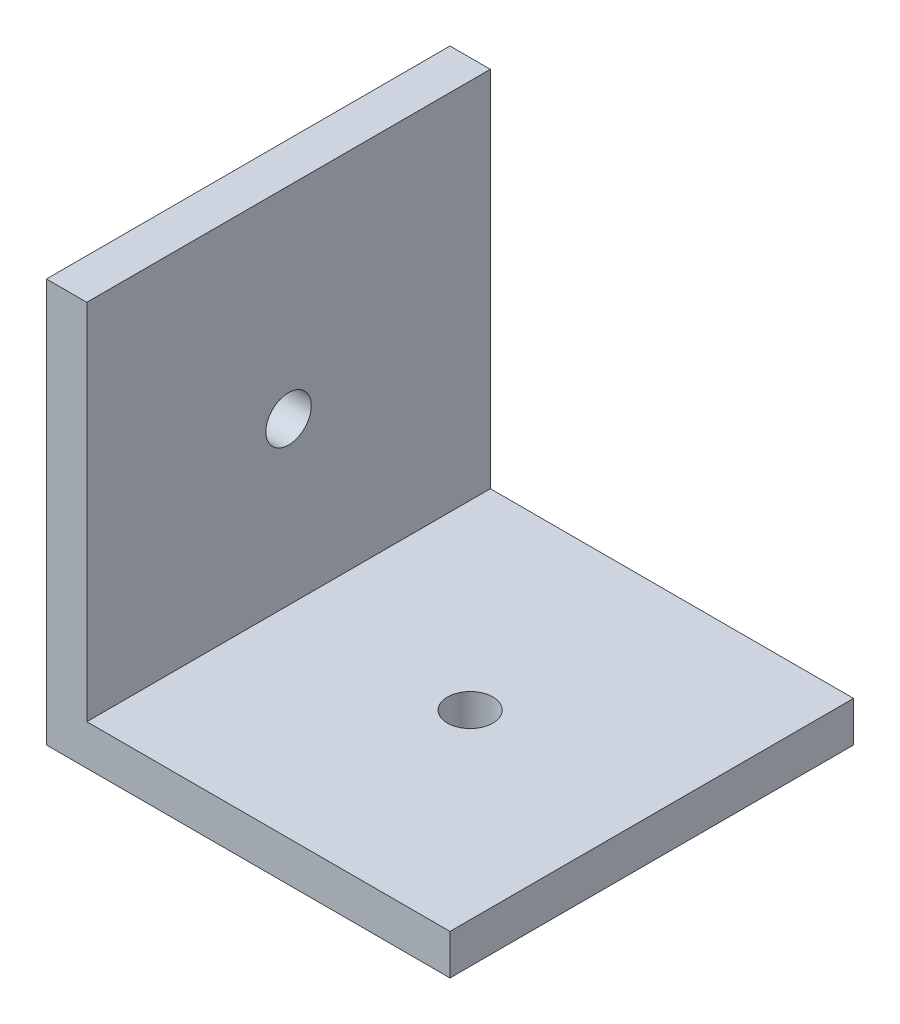
ISO-10303-21;
HEADER;
FILE_DESCRIPTION(('STEP AP214'),'2;1');
FILE_NAME('part.step','',(''),(''),'','','');
FILE_SCHEMA(('AUTOMOTIVE_DESIGN { 1 0 10303 214 1 1 1 1 }'));
ENDSEC;
DATA;
#1=APPLICATION_CONTEXT('core data for automotive mechanical design processes');
#2=APPLICATION_PROTOCOL_DEFINITION('international standard','automotive_design',2000,#1);
#3=PRODUCT_CONTEXT('',#1,'mechanical');
#4=PRODUCT('Part','Part','',(#3));
#5=PRODUCT_RELATED_PRODUCT_CATEGORY('part','',(#4));
#6=PRODUCT_DEFINITION_FORMATION('','',#4);
#7=PRODUCT_DEFINITION_CONTEXT('part definition',#1,'design');
#8=PRODUCT_DEFINITION('design','',#6,#7);
#9=PRODUCT_DEFINITION_SHAPE('','',#8);
#10=(LENGTH_UNIT() NAMED_UNIT(*) SI_UNIT(.MILLI.,.METRE.));
#11=(NAMED_UNIT(*) PLANE_ANGLE_UNIT() SI_UNIT($,.RADIAN.));
#12=(NAMED_UNIT(*) SI_UNIT($,.STERADIAN.) SOLID_ANGLE_UNIT());
#13=UNCERTAINTY_MEASURE_WITH_UNIT(LENGTH_MEASURE(1.E-05),#10,'distance_accuracy_value','');
#14=(GEOMETRIC_REPRESENTATION_CONTEXT(3) GLOBAL_UNCERTAINTY_ASSIGNED_CONTEXT((#13)) GLOBAL_UNIT_ASSIGNED_CONTEXT((#10,
#11,#12)) REPRESENTATION_CONTEXT('',''));
#15=CARTESIAN_POINT('',(0.,0.,0.));
#16=DIRECTION('',(0.,0.,1.));
#17=DIRECTION('',(1.,0.,0.));
#18=AXIS2_PLACEMENT_3D('',#15,#16,#17);
#19=CARTESIAN_POINT('',(-4.,36.,40.));
#20=DIRECTION('',(0.,-1.,0.));
#21=DIRECTION('',(0.,0.,-1.));
#22=AXIS2_PLACEMENT_3D('',#19,#20,#21);
#23=PLANE('',#22);
#24=DIRECTION('',(-1.,0.,0.));
#25=VECTOR('',#24,1.);
#26=CARTESIAN_POINT('',(-4.,36.,0.));
#27=LINE('',#26,#25);
#28=CARTESIAN_POINT('',(0.,36.,0.));
#29=VERTEX_POINT('',#28);
#30=CARTESIAN_POINT('',(-4.,36.,0.));
#31=VERTEX_POINT('',#30);
#32=EDGE_CURVE('E118',#29,#31,#27,.T.);
#33=ORIENTED_EDGE('',*,*,#32,.T.);
#34=DIRECTION('',(0.,0.,-1.));
#35=VECTOR('',#34,1.);
#36=CARTESIAN_POINT('',(-4.,36.,40.));
#37=LINE('',#36,#35);
#38=CARTESIAN_POINT('',(-4.,36.,40.));
#39=VERTEX_POINT('',#38);
#40=EDGE_CURVE('E11',#39,#31,#37,.T.);
#41=ORIENTED_EDGE('',*,*,#40,.F.);
#42=DIRECTION('',(-1.,0.,0.));
#43=VECTOR('',#42,1.);
#44=CARTESIAN_POINT('',(-4.,36.,40.));
#45=LINE('',#44,#43);
#46=CARTESIAN_POINT('',(0.,36.,40.));
#47=VERTEX_POINT('',#46);
#48=EDGE_CURVE('E129',#47,#39,#45,.T.);
#49=ORIENTED_EDGE('',*,*,#48,.F.);
#50=DIRECTION('',(0.,0.,-1.));
#51=VECTOR('',#50,1.);
#52=CARTESIAN_POINT('',(0.,36.,40.));
#53=LINE('',#52,#51);
#54=EDGE_CURVE('E114',#47,#29,#53,.T.);
#55=ORIENTED_EDGE('',*,*,#54,.T.);
#56=EDGE_LOOP('',(#33,#41,#49,#55));
#57=FACE_BOUND('',#56,.T.);
#58=ADVANCED_FACE('F34',(#57),#23,.F.);
#59=CARTESIAN_POINT('',(-4.,-4.00000000000001,40.));
#60=DIRECTION('',(1.,0.,0.));
#61=DIRECTION('',(0.,1.,0.));
#62=AXIS2_PLACEMENT_3D('',#59,#60,#61);
#63=PLANE('',#62);
#64=CARTESIAN_POINT('',(-4.00000000000001,16.,20.));
#65=DIRECTION('',(1.,0.,0.));
#66=DIRECTION('',(0.,0.,-1.));
#67=AXIS2_PLACEMENT_3D('',#64,#65,#66);
#68=CIRCLE('',#67,2.25);
#69=CARTESIAN_POINT('',(-4.00000000000001,16.,17.75));
#70=VERTEX_POINT('',#69);
#71=EDGE_CURVE('E227',#70,#70,#68,.T.);
#72=ORIENTED_EDGE('',*,*,#71,.T.);
#73=EDGE_LOOP('',(#72));
#74=FACE_BOUND('',#73,.T.);
#75=DIRECTION('',(0.,-1.,0.));
#76=VECTOR('',#75,1.);
#77=CARTESIAN_POINT('',(-4.,-4.00000000000001,0.));
#78=LINE('',#77,#76);
#79=CARTESIAN_POINT('',(-4.,-4.00000000000001,0.));
#80=VERTEX_POINT('',#79);
#81=EDGE_CURVE('E121',#31,#80,#78,.T.);
#82=ORIENTED_EDGE('',*,*,#81,.T.);
#83=DIRECTION('',(0.,0.,-1.));
#84=VECTOR('',#83,1.);
#85=CARTESIAN_POINT('',(-4.,-4.00000000000001,40.));
#86=LINE('',#85,#84);
#87=CARTESIAN_POINT('',(-4.,-4.00000000000001,40.));
#88=VERTEX_POINT('',#87);
#89=EDGE_CURVE('E42',#88,#80,#86,.T.);
#90=ORIENTED_EDGE('',*,*,#89,.F.);
#91=DIRECTION('',(0.,-1.,0.));
#92=VECTOR('',#91,1.);
#93=CARTESIAN_POINT('',(-4.,-4.00000000000001,40.));
#94=LINE('',#93,#92);
#95=EDGE_CURVE('E87',#39,#88,#94,.T.);
#96=ORIENTED_EDGE('',*,*,#95,.F.);
#97=ORIENTED_EDGE('',*,*,#40,.T.);
#98=EDGE_LOOP('',(#82,#90,#96,#97));
#99=FACE_BOUND('',#98,.T.);
#100=ADVANCED_FACE('F156',(#74,#99),#63,.F.);
#101=CARTESIAN_POINT('',(36.,-4.,40.));
#102=DIRECTION('',(0.,1.,0.));
#103=DIRECTION('',(-1.,0.,0.));
#104=AXIS2_PLACEMENT_3D('',#101,#102,#103);
#105=PLANE('',#104);
#106=CARTESIAN_POINT('',(18.,-4.00000000000001,20.));
#107=DIRECTION('',(0.,1.,0.));
#108=DIRECTION('',(0.,0.,1.));
#109=AXIS2_PLACEMENT_3D('',#106,#107,#108);
#110=CIRCLE('',#109,2.25);
#111=CARTESIAN_POINT('',(18.,-4.00000000000001,22.25));
#112=VERTEX_POINT('',#111);
#113=EDGE_CURVE('E122',#112,#112,#110,.T.);
#114=ORIENTED_EDGE('',*,*,#113,.T.);
#115=EDGE_LOOP('',(#114));
#116=FACE_BOUND('',#115,.T.);
#117=DIRECTION('',(1.,0.,0.));
#118=VECTOR('',#117,1.);
#119=CARTESIAN_POINT('',(36.,-4.,0.));
#120=LINE('',#119,#118);
#121=CARTESIAN_POINT('',(36.,-4.,0.));
#122=VERTEX_POINT('',#121);
#123=EDGE_CURVE('E124',#80,#122,#120,.T.);
#124=ORIENTED_EDGE('',*,*,#123,.T.);
#125=DIRECTION('',(0.,0.,-1.));
#126=VECTOR('',#125,1.);
#127=CARTESIAN_POINT('',(36.,-4.,40.));
#128=LINE('',#127,#126);
#129=CARTESIAN_POINT('',(36.,-4.,40.));
#130=VERTEX_POINT('',#129);
#131=EDGE_CURVE('E109',#130,#122,#128,.T.);
#132=ORIENTED_EDGE('',*,*,#131,.F.);
#133=DIRECTION('',(1.,0.,0.));
#134=VECTOR('',#133,1.);
#135=CARTESIAN_POINT('',(36.,-4.,40.));
#136=LINE('',#135,#134);
#137=EDGE_CURVE('E100',#88,#130,#136,.T.);
#138=ORIENTED_EDGE('',*,*,#137,.F.);
#139=ORIENTED_EDGE('',*,*,#89,.T.);
#140=EDGE_LOOP('',(#124,#132,#138,#139));
#141=FACE_BOUND('',#140,.T.);
#142=ADVANCED_FACE('F135',(#116,#141),#105,.F.);
#143=CARTESIAN_POINT('',(36.,0.,40.));
#144=DIRECTION('',(-1.,0.,0.));
#145=DIRECTION('',(0.,0.,1.));
#146=AXIS2_PLACEMENT_3D('',#143,#144,#145);
#147=PLANE('',#146);
#148=DIRECTION('',(0.,1.,0.));
#149=VECTOR('',#148,1.);
#150=CARTESIAN_POINT('',(36.,0.,0.));
#151=LINE('',#150,#149);
#152=CARTESIAN_POINT('',(36.,0.,0.));
#153=VERTEX_POINT('',#152);
#154=EDGE_CURVE('E108',#122,#153,#151,.T.);
#155=ORIENTED_EDGE('',*,*,#154,.T.);
#156=DIRECTION('',(0.,0.,-1.));
#157=VECTOR('',#156,1.);
#158=CARTESIAN_POINT('',(36.,0.,40.));
#159=LINE('',#158,#157);
#160=CARTESIAN_POINT('',(36.,0.,40.));
#161=VERTEX_POINT('',#160);
#162=EDGE_CURVE('E105',#161,#153,#159,.T.);
#163=ORIENTED_EDGE('',*,*,#162,.F.);
#164=DIRECTION('',(0.,1.,0.));
#165=VECTOR('',#164,1.);
#166=CARTESIAN_POINT('',(36.,0.,40.));
#167=LINE('',#166,#165);
#168=EDGE_CURVE('E94',#130,#161,#167,.T.);
#169=ORIENTED_EDGE('',*,*,#168,.F.);
#170=ORIENTED_EDGE('',*,*,#131,.T.);
#171=EDGE_LOOP('',(#155,#163,#169,#170));
#172=FACE_BOUND('',#171,.T.);
#173=ADVANCED_FACE('F106',(#172),#147,.F.);
#174=CARTESIAN_POINT('',(0.,0.,40.));
#175=DIRECTION('',(0.,-1.,0.));
#176=DIRECTION('',(0.,0.,-1.));
#177=AXIS2_PLACEMENT_3D('',#174,#175,#176);
#178=PLANE('',#177);
#179=CARTESIAN_POINT('',(18.,0.,20.));
#180=DIRECTION('',(0.,1.,0.));
#181=DIRECTION('',(0.,0.,1.));
#182=AXIS2_PLACEMENT_3D('',#179,#180,#181);
#183=CIRCLE('',#182,2.25);
#184=CARTESIAN_POINT('',(18.,0.,22.25));
#185=VERTEX_POINT('',#184);
#186=EDGE_CURVE('E231',#185,#185,#183,.T.);
#187=ORIENTED_EDGE('',*,*,#186,.F.);
#188=EDGE_LOOP('',(#187));
#189=FACE_BOUND('',#188,.T.);
#190=DIRECTION('',(-1.,0.,0.));
#191=VECTOR('',#190,1.);
#192=CARTESIAN_POINT('',(0.,0.,0.));
#193=LINE('',#192,#191);
#194=CARTESIAN_POINT('',(0.,0.,0.));
#195=VERTEX_POINT('',#194);
#196=EDGE_CURVE('E73',#153,#195,#193,.T.);
#197=ORIENTED_EDGE('',*,*,#196,.T.);
#198=DIRECTION('',(0.,0.,-1.));
#199=VECTOR('',#198,1.);
#200=CARTESIAN_POINT('',(0.,0.,40.));
#201=LINE('',#200,#199);
#202=CARTESIAN_POINT('',(0.,0.,40.));
#203=VERTEX_POINT('',#202);
#204=EDGE_CURVE('E110',#203,#195,#201,.T.);
#205=ORIENTED_EDGE('',*,*,#204,.F.);
#206=DIRECTION('',(-1.,0.,0.));
#207=VECTOR('',#206,1.);
#208=CARTESIAN_POINT('',(0.,0.,40.));
#209=LINE('',#208,#207);
#210=EDGE_CURVE('E98',#161,#203,#209,.T.);
#211=ORIENTED_EDGE('',*,*,#210,.F.);
#212=ORIENTED_EDGE('',*,*,#162,.T.);
#213=EDGE_LOOP('',(#197,#205,#211,#212));
#214=FACE_BOUND('',#213,.T.);
#215=ADVANCED_FACE('F112',(#189,#214),#178,.F.);
#216=CARTESIAN_POINT('',(0.,36.,40.));
#217=DIRECTION('',(-1.,0.,0.));
#218=DIRECTION('',(0.,-1.,0.));
#219=AXIS2_PLACEMENT_3D('',#216,#217,#218);
#220=PLANE('',#219);
#221=CARTESIAN_POINT('',(0.,16.,20.));
#222=DIRECTION('',(1.,0.,0.));
#223=DIRECTION('',(0.,0.,-1.));
#224=AXIS2_PLACEMENT_3D('',#221,#222,#223);
#225=CIRCLE('',#224,2.24999999999999);
#226=CARTESIAN_POINT('',(0.,16.,17.75));
#227=VERTEX_POINT('',#226);
#228=EDGE_CURVE('E229',#227,#227,#225,.T.);
#229=ORIENTED_EDGE('',*,*,#228,.F.);
#230=EDGE_LOOP('',(#229));
#231=FACE_BOUND('',#230,.T.);
#232=DIRECTION('',(0.,1.,0.));
#233=VECTOR('',#232,1.);
#234=CARTESIAN_POINT('',(0.,36.,0.));
#235=LINE('',#234,#233);
#236=EDGE_CURVE('E79',#195,#29,#235,.T.);
#237=ORIENTED_EDGE('',*,*,#236,.T.);
#238=ORIENTED_EDGE('',*,*,#54,.F.);
#239=DIRECTION('',(0.,1.,0.));
#240=VECTOR('',#239,1.);
#241=CARTESIAN_POINT('',(0.,36.,40.));
#242=LINE('',#241,#240);
#243=EDGE_CURVE('E50',#203,#47,#242,.T.);
#244=ORIENTED_EDGE('',*,*,#243,.F.);
#245=ORIENTED_EDGE('',*,*,#204,.T.);
#246=EDGE_LOOP('',(#237,#238,#244,#245));
#247=FACE_BOUND('',#246,.T.);
#248=ADVANCED_FACE('F142',(#231,#247),#220,.F.);
#249=CARTESIAN_POINT('',(0.,0.,40.));
#250=DIRECTION('',(0.,0.,-1.));
#251=DIRECTION('',(-1.,0.,0.));
#252=AXIS2_PLACEMENT_3D('',#249,#250,#251);
#253=PLANE('',#252);
#254=ORIENTED_EDGE('',*,*,#48,.T.);
#255=ORIENTED_EDGE('',*,*,#95,.T.);
#256=ORIENTED_EDGE('',*,*,#137,.T.);
#257=ORIENTED_EDGE('',*,*,#168,.T.);
#258=ORIENTED_EDGE('',*,*,#210,.T.);
#259=ORIENTED_EDGE('',*,*,#243,.T.);
#260=EDGE_LOOP('',(#254,#255,#256,#257,#258,#259));
#261=FACE_BOUND('',#260,.T.);
#262=ADVANCED_FACE('F96',(#261),#253,.F.);
#263=CARTESIAN_POINT('',(0.,0.,0.));
#264=DIRECTION('',(0.,0.,-1.));
#265=DIRECTION('',(-1.,0.,0.));
#266=AXIS2_PLACEMENT_3D('',#263,#264,#265);
#267=PLANE('',#266);
#268=ORIENTED_EDGE('',*,*,#32,.F.);
#269=ORIENTED_EDGE('',*,*,#236,.F.);
#270=ORIENTED_EDGE('',*,*,#196,.F.);
#271=ORIENTED_EDGE('',*,*,#154,.F.);
#272=ORIENTED_EDGE('',*,*,#123,.F.);
#273=ORIENTED_EDGE('',*,*,#81,.F.);
#274=EDGE_LOOP('',(#268,#269,#270,#271,#272,#273));
#275=FACE_BOUND('',#274,.T.);
#276=ADVANCED_FACE('F138',(#275),#267,.T.);
#277=CARTESIAN_POINT('',(18.,0.,20.));
#278=DIRECTION('',(0.,1.,0.));
#279=DIRECTION('',(0.,0.,1.));
#280=AXIS2_PLACEMENT_3D('',#277,#278,#279);
#281=CYLINDRICAL_SURFACE('',#280,2.25);
#282=ORIENTED_EDGE('',*,*,#113,.F.);
#283=EDGE_LOOP('',(#282));
#284=FACE_BOUND('',#283,.T.);
#285=ORIENTED_EDGE('',*,*,#186,.T.);
#286=EDGE_LOOP('',(#285));
#287=FACE_BOUND('',#286,.T.);
#288=ADVANCED_FACE('F187',(#284,#287),#281,.F.);
#289=CARTESIAN_POINT('',(0.,16.,20.));
#290=DIRECTION('',(1.,0.,0.));
#291=DIRECTION('',(0.,0.,-1.));
#292=AXIS2_PLACEMENT_3D('',#289,#290,#291);
#293=CYLINDRICAL_SURFACE('',#292,2.24999999999999);
#294=ORIENTED_EDGE('',*,*,#71,.F.);
#295=EDGE_LOOP('',(#294));
#296=FACE_BOUND('',#295,.T.);
#297=ORIENTED_EDGE('',*,*,#228,.T.);
#298=EDGE_LOOP('',(#297));
#299=FACE_BOUND('',#298,.T.);
#300=ADVANCED_FACE('F191',(#296,#299),#293,.F.);
#301=CLOSED_SHELL('',(#58,#100,#142,#173,#215,#248,#262,#276,#288,#300));
#302=MANIFOLD_SOLID_BREP('B2',#301);
#303=ADVANCED_BREP_SHAPE_REPRESENTATION('',(#18,#302),#14);
#304=SHAPE_DEFINITION_REPRESENTATION(#9,#303);
ENDSEC;
END-ISO-10303-21;
